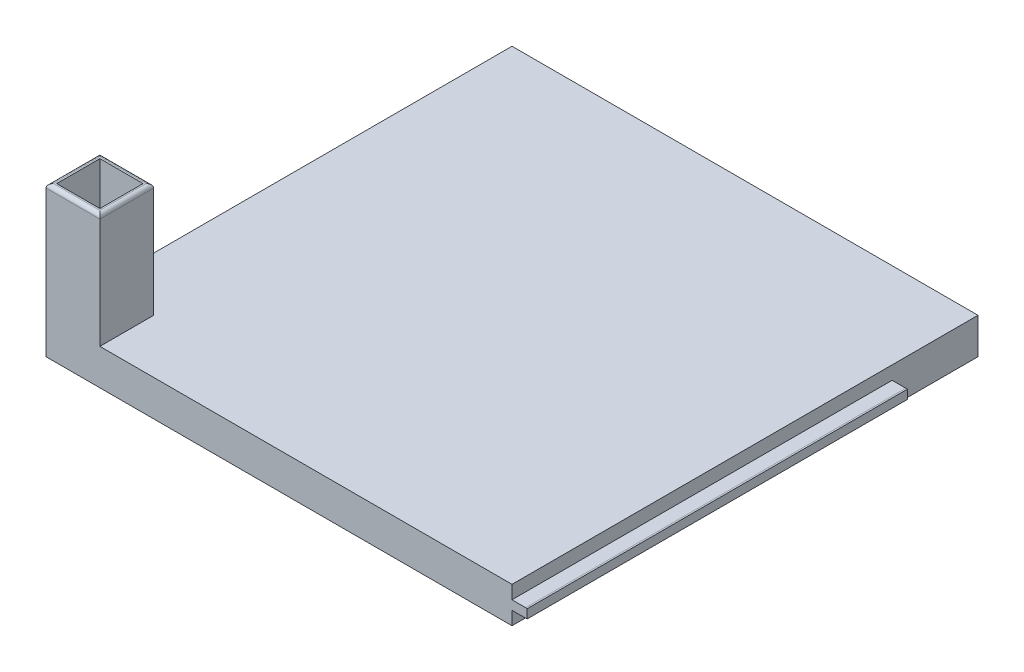
ISO-10303-21;
HEADER;
FILE_DESCRIPTION(('STEP AP214'),'2;1');
FILE_NAME('part.step','',(''),(''),'','','');
FILE_SCHEMA(('AUTOMOTIVE_DESIGN { 1 0 10303 214 1 1 1 1 }'));
ENDSEC;
DATA;
#1=APPLICATION_CONTEXT('core data for automotive mechanical design processes');
#2=APPLICATION_PROTOCOL_DEFINITION('international standard','automotive_design',2000,#1);
#3=PRODUCT_CONTEXT('',#1,'mechanical');
#4=PRODUCT('Part','Part','',(#3));
#5=PRODUCT_RELATED_PRODUCT_CATEGORY('part','',(#4));
#6=PRODUCT_DEFINITION_FORMATION('','',#4);
#7=PRODUCT_DEFINITION_CONTEXT('part definition',#1,'design');
#8=PRODUCT_DEFINITION('design','',#6,#7);
#9=PRODUCT_DEFINITION_SHAPE('','',#8);
#10=(LENGTH_UNIT() NAMED_UNIT(*) SI_UNIT(.MILLI.,.METRE.));
#11=(NAMED_UNIT(*) PLANE_ANGLE_UNIT() SI_UNIT($,.RADIAN.));
#12=(NAMED_UNIT(*) SI_UNIT($,.STERADIAN.) SOLID_ANGLE_UNIT());
#13=UNCERTAINTY_MEASURE_WITH_UNIT(LENGTH_MEASURE(1.E-05),#10,'distance_accuracy_value','');
#14=(GEOMETRIC_REPRESENTATION_CONTEXT(3) GLOBAL_UNCERTAINTY_ASSIGNED_CONTEXT((#13)) GLOBAL_UNIT_ASSIGNED_CONTEXT((#10,
#11,#12)) REPRESENTATION_CONTEXT('',''));
#15=CARTESIAN_POINT('',(0.,0.,0.));
#16=DIRECTION('',(0.,0.,1.));
#17=DIRECTION('',(1.,0.,0.));
#18=AXIS2_PLACEMENT_3D('',#15,#16,#17);
#19=CARTESIAN_POINT('',(-5.59121212121212,48.83,0.));
#20=DIRECTION('',(0.,0.,-1.));
#21=DIRECTION('',(-1.,0.,0.));
#22=AXIS2_PLACEMENT_3D('',#19,#20,#21);
#23=CYLINDRICAL_SURFACE('',#22,1.27);
#24=CARTESIAN_POINT('',(-5.59121212121214,48.83,123.095));
#25=DIRECTION('',(-0.707106781186547,0.,-0.707106781186548));
#26=DIRECTION('',(-0.707106781186548,0.,0.707106781186547));
#27=AXIS2_PLACEMENT_3D('',#24,#25,#26);
#28=ELLIPSE('',#27,1.79605122421383,1.27);
#29=CARTESIAN_POINT('',(-5.59121212121214,50.1,123.095));
#30=VERTEX_POINT('',#29);
#31=CARTESIAN_POINT('',(-4.32121212121214,48.83,121.825));
#32=VERTEX_POINT('',#31);
#33=EDGE_CURVE('E11',#30,#32,#28,.T.);
#34=ORIENTED_EDGE('',*,*,#33,.F.);
#35=DIRECTION('',(0.,0.,-1.));
#36=VECTOR('',#35,1.);
#37=CARTESIAN_POINT('',(-5.59121212121212,50.1,0.));
#38=LINE('',#37,#36);
#39=CARTESIAN_POINT('',(-5.59121212121214,50.1,138.555));
#40=VERTEX_POINT('',#39);
#41=EDGE_CURVE('E533',#40,#30,#38,.T.);
#42=ORIENTED_EDGE('',*,*,#41,.F.);
#43=CARTESIAN_POINT('',(-5.59121212121214,48.83,138.555));
#44=DIRECTION('',(0.707106781186548,0.,-0.707106781186547));
#45=DIRECTION('',(-0.707106781186547,0.,-0.707106781186548));
#46=AXIS2_PLACEMENT_3D('',#43,#44,#45);
#47=ELLIPSE('',#46,1.79605122421383,1.27);
#48=CARTESIAN_POINT('',(-4.32121212121214,48.83,139.825));
#49=VERTEX_POINT('',#48);
#50=EDGE_CURVE('E55',#40,#49,#47,.T.);
#51=ORIENTED_EDGE('',*,*,#50,.T.);
#52=DIRECTION('',(0.,0.,-1.));
#53=VECTOR('',#52,1.);
#54=CARTESIAN_POINT('',(-4.32121212121214,48.83,139.825));
#55=LINE('',#54,#53);
#56=EDGE_CURVE('E560',#32,#49,#55,.F.);
#57=ORIENTED_EDGE('',*,*,#56,.F.);
#58=EDGE_LOOP('',(#34,#42,#51,#57));
#59=FACE_BOUND('',#58,.T.);
#60=ADVANCED_FACE('F47',(#59),#23,.T.);
#61=CARTESIAN_POINT('',(0.,48.83,138.555));
#62=DIRECTION('',(1.,0.,0.));
#63=DIRECTION('',(0.,0.,-1.));
#64=AXIS2_PLACEMENT_3D('',#61,#62,#63);
#65=CYLINDRICAL_SURFACE('',#64,1.27);
#66=ORIENTED_EDGE('',*,*,#50,.F.);
#67=DIRECTION('',(1.,0.,0.));
#68=VECTOR('',#67,1.);
#69=CARTESIAN_POINT('',(0.,50.1,138.555));
#70=LINE('',#69,#68);
#71=CARTESIAN_POINT('',(-21.0512121212121,50.1,138.555));
#72=VERTEX_POINT('',#71);
#73=EDGE_CURVE('E537',#72,#40,#70,.T.);
#74=ORIENTED_EDGE('',*,*,#73,.F.);
#75=CARTESIAN_POINT('',(-21.0512121212121,48.83,138.555));
#76=DIRECTION('',(0.707106781186547,0.,0.707106781186547));
#77=DIRECTION('',(0.707106781186547,0.,-0.707106781186547));
#78=AXIS2_PLACEMENT_3D('',#75,#76,#77);
#79=ELLIPSE('',#78,1.79605122421383,1.27);
#80=CARTESIAN_POINT('',(-22.3212121212121,48.83,139.825));
#81=VERTEX_POINT('',#80);
#82=EDGE_CURVE('E69',#72,#81,#79,.T.);
#83=ORIENTED_EDGE('',*,*,#82,.T.);
#84=DIRECTION('',(1.,0.,0.));
#85=VECTOR('',#84,1.);
#86=CARTESIAN_POINT('',(-22.3212121212121,48.83,139.825));
#87=LINE('',#86,#85);
#88=EDGE_CURVE('E557',#49,#81,#87,.F.);
#89=ORIENTED_EDGE('',*,*,#88,.F.);
#90=EDGE_LOOP('',(#66,#74,#83,#89));
#91=FACE_BOUND('',#90,.T.);
#92=ADVANCED_FACE('F640',(#91),#65,.T.);
#93=CARTESIAN_POINT('',(-21.0512121212121,48.83,0.));
#94=DIRECTION('',(0.,0.,1.));
#95=DIRECTION('',(1.,0.,0.));
#96=AXIS2_PLACEMENT_3D('',#93,#94,#95);
#97=CYLINDRICAL_SURFACE('',#96,1.27);
#98=ORIENTED_EDGE('',*,*,#82,.F.);
#99=DIRECTION('',(0.,0.,1.));
#100=VECTOR('',#99,1.);
#101=CARTESIAN_POINT('',(-21.0512121212121,50.1,0.));
#102=LINE('',#101,#100);
#103=CARTESIAN_POINT('',(-21.0512121212121,50.1,123.095));
#104=VERTEX_POINT('',#103);
#105=EDGE_CURVE('E541',#104,#72,#102,.T.);
#106=ORIENTED_EDGE('',*,*,#105,.F.);
#107=CARTESIAN_POINT('',(-21.0512121212121,48.83,123.095));
#108=DIRECTION('',(-0.707106781186547,0.,0.707106781186547));
#109=DIRECTION('',(0.707106781186547,0.,0.707106781186547));
#110=AXIS2_PLACEMENT_3D('',#107,#108,#109);
#111=ELLIPSE('',#110,1.79605122421383,1.27);
#112=CARTESIAN_POINT('',(-22.3212121212121,48.83,121.825));
#113=VERTEX_POINT('',#112);
#114=EDGE_CURVE('E563',#104,#113,#111,.T.);
#115=ORIENTED_EDGE('',*,*,#114,.T.);
#116=DIRECTION('',(0.,0.,1.));
#117=VECTOR('',#116,1.);
#118=CARTESIAN_POINT('',(-22.3212121212121,48.83,-15.875));
#119=LINE('',#118,#117);
#120=EDGE_CURVE('E553',#81,#113,#119,.F.);
#121=ORIENTED_EDGE('',*,*,#120,.F.);
#122=EDGE_LOOP('',(#98,#106,#115,#121));
#123=FACE_BOUND('',#122,.T.);
#124=ADVANCED_FACE('F645',(#123),#97,.T.);
#125=CARTESIAN_POINT('',(0.,48.83,123.095));
#126=DIRECTION('',(-1.,0.,0.));
#127=DIRECTION('',(0.,0.,1.));
#128=AXIS2_PLACEMENT_3D('',#125,#126,#127);
#129=CYLINDRICAL_SURFACE('',#128,1.27);
#130=DIRECTION('',(-1.,0.,0.));
#131=VECTOR('',#130,1.);
#132=CARTESIAN_POINT('',(0.,50.1,123.095));
#133=LINE('',#132,#131);
#134=EDGE_CURVE('E545',#30,#104,#133,.T.);
#135=ORIENTED_EDGE('',*,*,#134,.F.);
#136=ORIENTED_EDGE('',*,*,#33,.T.);
#137=DIRECTION('',(-1.,0.,0.));
#138=VECTOR('',#137,1.);
#139=CARTESIAN_POINT('',(-22.3212121212121,48.83,121.825));
#140=LINE('',#139,#138);
#141=EDGE_CURVE('E549',#113,#32,#140,.F.);
#142=ORIENTED_EDGE('',*,*,#141,.F.);
#143=ORIENTED_EDGE('',*,*,#114,.F.);
#144=EDGE_LOOP('',(#135,#136,#142,#143));
#145=FACE_BOUND('',#144,.T.);
#146=ADVANCED_FACE('F597',(#145),#129,.T.);
#147=CARTESIAN_POINT('',(0.,50.1,0.));
#148=DIRECTION('',(0.,-1.,0.));
#149=DIRECTION('',(0.,0.,-1.));
#150=AXIS2_PLACEMENT_3D('',#147,#148,#149);
#151=PLANE('',#150);
#152=ORIENTED_EDGE('',*,*,#41,.T.);
#153=ORIENTED_EDGE('',*,*,#134,.T.);
#154=ORIENTED_EDGE('',*,*,#105,.T.);
#155=ORIENTED_EDGE('',*,*,#73,.T.);
#156=EDGE_LOOP('',(#152,#153,#154,#155));
#157=FACE_BOUND('',#156,.T.);
#158=DIRECTION('',(0.,0.,1.));
#159=VECTOR('',#158,1.);
#160=CARTESIAN_POINT('',(-20.5432121212121,50.1,0.));
#161=LINE('',#160,#159);
#162=CARTESIAN_POINT('',(-20.5432121212121,50.1,123.603));
#163=VERTEX_POINT('',#162);
#164=CARTESIAN_POINT('',(-20.5432121212121,50.1,138.047));
#165=VERTEX_POINT('',#164);
#166=EDGE_CURVE('E343',#163,#165,#161,.T.);
#167=ORIENTED_EDGE('',*,*,#166,.F.);
#168=DIRECTION('',(-1.,0.,0.));
#169=VECTOR('',#168,1.);
#170=CARTESIAN_POINT('',(0.,50.1,123.603));
#171=LINE('',#170,#169);
#172=CARTESIAN_POINT('',(-6.09921212121214,50.1,123.603));
#173=VERTEX_POINT('',#172);
#174=EDGE_CURVE('E312',#173,#163,#171,.T.);
#175=ORIENTED_EDGE('',*,*,#174,.F.);
#176=DIRECTION('',(0.,0.,-1.));
#177=VECTOR('',#176,1.);
#178=CARTESIAN_POINT('',(-6.09921212121212,50.1,0.));
#179=LINE('',#178,#177);
#180=CARTESIAN_POINT('',(-6.09921212121214,50.1,138.047));
#181=VERTEX_POINT('',#180);
#182=EDGE_CURVE('E365',#181,#173,#179,.T.);
#183=ORIENTED_EDGE('',*,*,#182,.F.);
#184=DIRECTION('',(1.,0.,0.));
#185=VECTOR('',#184,1.);
#186=CARTESIAN_POINT('',(0.,50.1,138.047));
#187=LINE('',#186,#185);
#188=EDGE_CURVE('E362',#165,#181,#187,.T.);
#189=ORIENTED_EDGE('',*,*,#188,.F.);
#190=EDGE_LOOP('',(#167,#175,#183,#189));
#191=FACE_BOUND('',#190,.T.);
#192=ADVANCED_FACE('F648',(#157,#191),#151,.F.);
#193=CARTESIAN_POINT('',(133.378787878788,12.,-15.875));
#194=DIRECTION('',(-1.,0.,0.));
#195=DIRECTION('',(0.,0.,1.));
#196=AXIS2_PLACEMENT_3D('',#193,#194,#195);
#197=PLANE('',#196);
#198=DIRECTION('',(0.,0.,1.));
#199=VECTOR('',#198,1.);
#200=CARTESIAN_POINT('',(133.378787878788,7.524,12.825));
#201=LINE('',#200,#199);
#202=CARTESIAN_POINT('',(133.378787878788,7.524,12.825));
#203=VERTEX_POINT('',#202);
#204=CARTESIAN_POINT('',(133.378787878788,7.524,139.825));
#205=VERTEX_POINT('',#204);
#206=EDGE_CURVE('E437',#203,#205,#201,.T.);
#207=ORIENTED_EDGE('',*,*,#206,.F.);
#208=DIRECTION('',(0.,-1.,0.));
#209=VECTOR('',#208,1.);
#210=CARTESIAN_POINT('',(133.378787878788,7.524,12.825));
#211=LINE('',#210,#209);
#212=CARTESIAN_POINT('',(133.378787878788,4.476,12.825));
#213=VERTEX_POINT('',#212);
#214=EDGE_CURVE('E413',#203,#213,#211,.T.);
#215=ORIENTED_EDGE('',*,*,#214,.T.);
#216=DIRECTION('',(0.,0.,1.));
#217=VECTOR('',#216,1.);
#218=CARTESIAN_POINT('',(133.378787878788,4.476,12.825));
#219=LINE('',#218,#217);
#220=CARTESIAN_POINT('',(133.378787878788,4.476,139.825));
#221=VERTEX_POINT('',#220);
#222=EDGE_CURVE('E428',#213,#221,#219,.T.);
#223=ORIENTED_EDGE('',*,*,#222,.T.);
#224=DIRECTION('',(0.,-1.,0.));
#225=VECTOR('',#224,1.);
#226=CARTESIAN_POINT('',(133.378787878788,12.,139.825));
#227=LINE('',#226,#225);
#228=CARTESIAN_POINT('',(133.378787878788,0.,139.825));
#229=VERTEX_POINT('',#228);
#230=EDGE_CURVE('E498',#221,#229,#227,.T.);
#231=ORIENTED_EDGE('',*,*,#230,.T.);
#232=DIRECTION('',(0.,0.,-1.));
#233=VECTOR('',#232,1.);
#234=CARTESIAN_POINT('',(133.378787878788,0.,-15.875));
#235=LINE('',#234,#233);
#236=CARTESIAN_POINT('',(133.378787878788,0.,-15.875));
#237=VERTEX_POINT('',#236);
#238=EDGE_CURVE('E484',#229,#237,#235,.T.);
#239=ORIENTED_EDGE('',*,*,#238,.T.);
#240=DIRECTION('',(0.,-1.,0.));
#241=VECTOR('',#240,1.);
#242=CARTESIAN_POINT('',(133.378787878788,12.,-15.875));
#243=LINE('',#242,#241);
#244=CARTESIAN_POINT('',(133.378787878788,12.,-15.875));
#245=VERTEX_POINT('',#244);
#246=EDGE_CURVE('E494',#245,#237,#243,.T.);
#247=ORIENTED_EDGE('',*,*,#246,.F.);
#248=DIRECTION('',(0.,0.,-1.));
#249=VECTOR('',#248,1.);
#250=CARTESIAN_POINT('',(133.378787878788,12.,-15.875));
#251=LINE('',#250,#249);
#252=CARTESIAN_POINT('',(133.378787878788,12.,139.825));
#253=VERTEX_POINT('',#252);
#254=EDGE_CURVE('E470',#253,#245,#251,.T.);
#255=ORIENTED_EDGE('',*,*,#254,.F.);
#256=EDGE_CURVE('E499',#253,#205,#227,.T.);
#257=ORIENTED_EDGE('',*,*,#256,.T.);
#258=EDGE_LOOP('',(#207,#215,#223,#231,#239,#247,#255,#257));
#259=FACE_BOUND('',#258,.T.);
#260=ADVANCED_FACE('F613',(#259),#197,.F.);
#261=CARTESIAN_POINT('',(-22.3212121212121,12.,-15.875));
#262=DIRECTION('',(1.,0.,0.));
#263=DIRECTION('',(0.,0.,-1.));
#264=AXIS2_PLACEMENT_3D('',#261,#262,#263);
#265=PLANE('',#264);
#266=DIRECTION('',(0.,-1.,0.));
#267=VECTOR('',#266,1.);
#268=CARTESIAN_POINT('',(-22.3212121212121,12.,139.825));
#269=LINE('',#268,#267);
#270=CARTESIAN_POINT('',(-22.3212121212121,0.,139.825));
#271=VERTEX_POINT('',#270);
#272=EDGE_CURVE('E503',#81,#271,#269,.T.);
#273=ORIENTED_EDGE('',*,*,#272,.F.);
#274=ORIENTED_EDGE('',*,*,#120,.T.);
#275=DIRECTION('',(0.,-1.,0.));
#276=VECTOR('',#275,1.);
#277=CARTESIAN_POINT('',(-22.3212121212121,50.1,121.825));
#278=LINE('',#277,#276);
#279=CARTESIAN_POINT('',(-22.3212121212121,12.,121.825));
#280=VERTEX_POINT('',#279);
#281=EDGE_CURVE('E452',#113,#280,#278,.T.);
#282=ORIENTED_EDGE('',*,*,#281,.T.);
#283=DIRECTION('',(0.,0.,1.));
#284=VECTOR('',#283,1.);
#285=CARTESIAN_POINT('',(-22.3212121212121,12.,-15.875));
#286=LINE('',#285,#284);
#287=CARTESIAN_POINT('',(-22.3212121212121,12.,-15.875));
#288=VERTEX_POINT('',#287);
#289=EDGE_CURVE('E462',#288,#280,#286,.T.);
#290=ORIENTED_EDGE('',*,*,#289,.F.);
#291=DIRECTION('',(0.,-1.,0.));
#292=VECTOR('',#291,1.);
#293=CARTESIAN_POINT('',(-22.3212121212121,12.,-15.875));
#294=LINE('',#293,#292);
#295=CARTESIAN_POINT('',(-22.3212121212121,7.5875,-15.875));
#296=VERTEX_POINT('',#295);
#297=EDGE_CURVE('E490',#288,#296,#294,.T.);
#298=ORIENTED_EDGE('',*,*,#297,.T.);
#299=DIRECTION('',(0.,0.,1.));
#300=VECTOR('',#299,1.);
#301=CARTESIAN_POINT('',(-22.3212121212121,7.5875,-15.875));
#302=LINE('',#301,#300);
#303=CARTESIAN_POINT('',(-22.3212121212121,7.5875,-10.541));
#304=VERTEX_POINT('',#303);
#305=EDGE_CURVE('E379',#296,#304,#302,.T.);
#306=ORIENTED_EDGE('',*,*,#305,.T.);
#307=DIRECTION('',(0.,-1.,0.));
#308=VECTOR('',#307,1.);
#309=CARTESIAN_POINT('',(-22.3212121212121,7.5875,-10.541));
#310=LINE('',#309,#308);
#311=CARTESIAN_POINT('',(-22.3212121212121,4.4125,-10.541));
#312=VERTEX_POINT('',#311);
#313=EDGE_CURVE('E393',#304,#312,#310,.T.);
#314=ORIENTED_EDGE('',*,*,#313,.T.);
#315=DIRECTION('',(0.,0.,1.));
#316=VECTOR('',#315,1.);
#317=CARTESIAN_POINT('',(-22.3212121212121,4.4125,-15.875));
#318=LINE('',#317,#316);
#319=CARTESIAN_POINT('',(-22.3212121212121,4.4125,-15.875));
#320=VERTEX_POINT('',#319);
#321=EDGE_CURVE('E292',#320,#312,#318,.T.);
#322=ORIENTED_EDGE('',*,*,#321,.F.);
#323=CARTESIAN_POINT('',(-22.3212121212121,0.,-15.875));
#324=VERTEX_POINT('',#323);
#325=EDGE_CURVE('E476',#320,#324,#294,.T.);
#326=ORIENTED_EDGE('',*,*,#325,.T.);
#327=DIRECTION('',(0.,0.,1.));
#328=VECTOR('',#327,1.);
#329=CARTESIAN_POINT('',(-22.3212121212121,0.,-15.875));
#330=LINE('',#329,#328);
#331=EDGE_CURVE('E461',#324,#271,#330,.T.);
#332=ORIENTED_EDGE('',*,*,#331,.T.);
#333=EDGE_LOOP('',(#273,#274,#282,#290,#298,#306,#314,#322,#326,#332));
#334=FACE_BOUND('',#333,.T.);
#335=ADVANCED_FACE('F574',(#334),#265,.F.);
#336=CARTESIAN_POINT('',(-22.3212121212121,12.,139.825));
#337=DIRECTION('',(0.,0.,-1.));
#338=DIRECTION('',(-1.,0.,0.));
#339=AXIS2_PLACEMENT_3D('',#336,#337,#338);
#340=PLANE('',#339);
#341=DIRECTION('',(0.,-1.,0.));
#342=VECTOR('',#341,1.);
#343=CARTESIAN_POINT('',(-4.32121212121214,50.1,139.825));
#344=LINE('',#343,#342);
#345=CARTESIAN_POINT('',(-4.32121212121214,12.,139.825));
#346=VERTEX_POINT('',#345);
#347=EDGE_CURVE('E458',#49,#346,#344,.T.);
#348=ORIENTED_EDGE('',*,*,#347,.F.);
#349=ORIENTED_EDGE('',*,*,#88,.T.);
#350=ORIENTED_EDGE('',*,*,#272,.T.);
#351=DIRECTION('',(1.,0.,0.));
#352=VECTOR('',#351,1.);
#353=CARTESIAN_POINT('',(-22.3212121212121,0.,139.825));
#354=LINE('',#353,#352);
#355=EDGE_CURVE('E480',#271,#229,#354,.T.);
#356=ORIENTED_EDGE('',*,*,#355,.T.);
#357=ORIENTED_EDGE('',*,*,#230,.F.);
#358=DIRECTION('',(1.,0.,0.));
#359=VECTOR('',#358,1.);
#360=CARTESIAN_POINT('',(133.378787878788,4.476,139.825));
#361=LINE('',#360,#359);
#362=CARTESIAN_POINT('',(137.950787878788,4.476,139.825));
#363=VERTEX_POINT('',#362);
#364=EDGE_CURVE('E403',#221,#363,#361,.T.);
#365=ORIENTED_EDGE('',*,*,#364,.T.);
#366=DIRECTION('',(-0.997564050259824,-0.0697564737441272,0.));
#367=VECTOR('',#366,1.);
#368=CARTESIAN_POINT('',(137.950787878788,4.476,139.825));
#369=LINE('',#368,#367);
#370=CARTESIAN_POINT('',(138.458787878788,4.51152282046731,139.825));
#371=VERTEX_POINT('',#370);
#372=EDGE_CURVE('E524',#363,#371,#369,.F.);
#373=ORIENTED_EDGE('',*,*,#372,.T.);
#374=DIRECTION('',(0.,1.,0.));
#375=VECTOR('',#374,1.);
#376=CARTESIAN_POINT('',(138.458787878788,7.524,139.825));
#377=LINE('',#376,#375);
#378=CARTESIAN_POINT('',(138.458787878788,7.4884771795327,139.825));
#379=VERTEX_POINT('',#378);
#380=EDGE_CURVE('E432',#371,#379,#377,.T.);
#381=ORIENTED_EDGE('',*,*,#380,.T.);
#382=DIRECTION('',(0.997564050259824,-0.0697564737441272,0.));
#383=VECTOR('',#382,1.);
#384=CARTESIAN_POINT('',(138.458787878788,7.4884771795327,139.825));
#385=LINE('',#384,#383);
#386=CARTESIAN_POINT('',(137.950787878788,7.524,139.825));
#387=VERTEX_POINT('',#386);
#388=EDGE_CURVE('E510',#379,#387,#385,.F.);
#389=ORIENTED_EDGE('',*,*,#388,.T.);
#390=DIRECTION('',(-1.,0.,0.));
#391=VECTOR('',#390,1.);
#392=CARTESIAN_POINT('',(133.378787878788,7.524,139.825));
#393=LINE('',#392,#391);
#394=EDGE_CURVE('E418',#387,#205,#393,.T.);
#395=ORIENTED_EDGE('',*,*,#394,.T.);
#396=ORIENTED_EDGE('',*,*,#256,.F.);
#397=DIRECTION('',(1.,0.,0.));
#398=VECTOR('',#397,1.);
#399=CARTESIAN_POINT('',(-22.3212121212121,12.,139.825));
#400=LINE('',#399,#398);
#401=EDGE_CURVE('E466',#346,#253,#400,.T.);
#402=ORIENTED_EDGE('',*,*,#401,.F.);
#403=EDGE_LOOP('',(#348,#349,#350,#356,#357,#365,#373,#381,#389,#395,#396,#402));
#404=FACE_BOUND('',#403,.T.);
#405=ADVANCED_FACE('F589',(#404),#340,.F.);
#406=CARTESIAN_POINT('',(-22.3212121212121,12.,-15.875));
#407=DIRECTION('',(0.,0.,1.));
#408=DIRECTION('',(1.,0.,0.));
#409=AXIS2_PLACEMENT_3D('',#406,#407,#408);
#410=PLANE('',#409);
#411=ORIENTED_EDGE('',*,*,#325,.F.);
#412=DIRECTION('',(-1.,0.,0.));
#413=VECTOR('',#412,1.);
#414=CARTESIAN_POINT('',(127.538787878788,4.4125,-15.875));
#415=LINE('',#414,#413);
#416=CARTESIAN_POINT('',(127.538787878788,4.4125,-15.875));
#417=VERTEX_POINT('',#416);
#418=EDGE_CURVE('E400',#417,#320,#415,.T.);
#419=ORIENTED_EDGE('',*,*,#418,.F.);
#420=DIRECTION('',(0.,-1.,0.));
#421=VECTOR('',#420,1.);
#422=CARTESIAN_POINT('',(127.538787878788,7.5875,-15.875));
#423=LINE('',#422,#421);
#424=CARTESIAN_POINT('',(127.538787878788,7.5875,-15.875));
#425=VERTEX_POINT('',#424);
#426=EDGE_CURVE('E385',#425,#417,#423,.T.);
#427=ORIENTED_EDGE('',*,*,#426,.F.);
#428=DIRECTION('',(-1.,0.,0.));
#429=VECTOR('',#428,1.);
#430=CARTESIAN_POINT('',(127.538787878788,7.5875,-15.875));
#431=LINE('',#430,#429);
#432=EDGE_CURVE('E404',#425,#296,#431,.T.);
#433=ORIENTED_EDGE('',*,*,#432,.T.);
#434=ORIENTED_EDGE('',*,*,#297,.F.);
#435=DIRECTION('',(-1.,0.,0.));
#436=VECTOR('',#435,1.);
#437=CARTESIAN_POINT('',(-22.3212121212121,12.,-15.875));
#438=LINE('',#437,#436);
#439=EDGE_CURVE('E473',#245,#288,#438,.T.);
#440=ORIENTED_EDGE('',*,*,#439,.F.);
#441=ORIENTED_EDGE('',*,*,#246,.T.);
#442=DIRECTION('',(-1.,0.,0.));
#443=VECTOR('',#442,1.);
#444=CARTESIAN_POINT('',(-22.3212121212121,0.,-15.875));
#445=LINE('',#444,#443);
#446=EDGE_CURVE('E467',#237,#324,#445,.T.);
#447=ORIENTED_EDGE('',*,*,#446,.T.);
#448=EDGE_LOOP('',(#411,#419,#427,#433,#434,#440,#441,#447));
#449=FACE_BOUND('',#448,.T.);
#450=ADVANCED_FACE('F579',(#449),#410,.F.);
#451=CARTESIAN_POINT('',(0.,12.,0.));
#452=DIRECTION('',(0.,1.,0.));
#453=DIRECTION('',(0.,0.,1.));
#454=AXIS2_PLACEMENT_3D('',#451,#452,#453);
#455=PLANE('',#454);
#456=DIRECTION('',(-1.,0.,0.));
#457=VECTOR('',#456,1.);
#458=CARTESIAN_POINT('',(-22.3212121212121,12.,121.825));
#459=LINE('',#458,#457);
#460=CARTESIAN_POINT('',(-4.32121212121214,12.,121.825));
#461=VERTEX_POINT('',#460);
#462=EDGE_CURVE('E448',#461,#280,#459,.T.);
#463=ORIENTED_EDGE('',*,*,#462,.F.);
#464=DIRECTION('',(0.,0.,-1.));
#465=VECTOR('',#464,1.);
#466=CARTESIAN_POINT('',(-4.32121212121214,12.,139.825));
#467=LINE('',#466,#465);
#468=EDGE_CURVE('E441',#346,#461,#467,.T.);
#469=ORIENTED_EDGE('',*,*,#468,.F.);
#470=ORIENTED_EDGE('',*,*,#401,.T.);
#471=ORIENTED_EDGE('',*,*,#254,.T.);
#472=ORIENTED_EDGE('',*,*,#439,.T.);
#473=ORIENTED_EDGE('',*,*,#289,.T.);
#474=EDGE_LOOP('',(#463,#469,#470,#471,#472,#473));
#475=FACE_BOUND('',#474,.T.);
#476=ADVANCED_FACE('F604',(#475),#455,.T.);
#477=CARTESIAN_POINT('',(0.,0.,0.));
#478=DIRECTION('',(0.,1.,0.));
#479=DIRECTION('',(0.,0.,1.));
#480=AXIS2_PLACEMENT_3D('',#477,#478,#479);
#481=PLANE('',#480);
#482=ORIENTED_EDGE('',*,*,#331,.F.);
#483=ORIENTED_EDGE('',*,*,#446,.F.);
#484=ORIENTED_EDGE('',*,*,#238,.F.);
#485=ORIENTED_EDGE('',*,*,#355,.F.);
#486=EDGE_LOOP('',(#482,#483,#484,#485));
#487=FACE_BOUND('',#486,.T.);
#488=ADVANCED_FACE('F585',(#487),#481,.F.);
#489=CARTESIAN_POINT('',(-4.32121212121214,50.1,139.825));
#490=DIRECTION('',(-1.,0.,0.));
#491=DIRECTION('',(0.,0.,1.));
#492=AXIS2_PLACEMENT_3D('',#489,#490,#491);
#493=PLANE('',#492);
#494=DIRECTION('',(0.,-1.,0.));
#495=VECTOR('',#494,1.);
#496=CARTESIAN_POINT('',(-4.32121212121214,50.1,121.825));
#497=LINE('',#496,#495);
#498=EDGE_CURVE('E455',#32,#461,#497,.T.);
#499=ORIENTED_EDGE('',*,*,#498,.F.);
#500=ORIENTED_EDGE('',*,*,#56,.T.);
#501=ORIENTED_EDGE('',*,*,#347,.T.);
#502=ORIENTED_EDGE('',*,*,#468,.T.);
#503=EDGE_LOOP('',(#499,#500,#501,#502));
#504=FACE_BOUND('',#503,.T.);
#505=ADVANCED_FACE('F607',(#504),#493,.F.);
#506=CARTESIAN_POINT('',(-22.3212121212121,50.1,121.825));
#507=DIRECTION('',(0.,0.,1.));
#508=DIRECTION('',(1.,0.,0.));
#509=AXIS2_PLACEMENT_3D('',#506,#507,#508);
#510=PLANE('',#509);
#511=ORIENTED_EDGE('',*,*,#281,.F.);
#512=ORIENTED_EDGE('',*,*,#141,.T.);
#513=ORIENTED_EDGE('',*,*,#498,.T.);
#514=ORIENTED_EDGE('',*,*,#462,.T.);
#515=EDGE_LOOP('',(#511,#512,#513,#514));
#516=FACE_BOUND('',#515,.T.);
#517=ADVANCED_FACE('F600',(#516),#510,.F.);
#518=CARTESIAN_POINT('',(133.378787878788,7.524,12.825));
#519=DIRECTION('',(0.,1.,0.));
#520=DIRECTION('',(0.,0.,1.));
#521=AXIS2_PLACEMENT_3D('',#518,#519,#520);
#522=PLANE('',#521);
#523=ORIENTED_EDGE('',*,*,#394,.F.);
#524=DIRECTION('',(0.,0.,-1.));
#525=VECTOR('',#524,1.);
#526=CARTESIAN_POINT('',(137.950787878788,7.524,12.825));
#527=LINE('',#526,#525);
#528=CARTESIAN_POINT('',(137.950787878788,7.524,12.825));
#529=VERTEX_POINT('',#528);
#530=EDGE_CURVE('E513',#387,#529,#527,.T.);
#531=ORIENTED_EDGE('',*,*,#530,.T.);
#532=DIRECTION('',(-1.,0.,0.));
#533=VECTOR('',#532,1.);
#534=CARTESIAN_POINT('',(133.378787878788,7.524,12.825));
#535=LINE('',#534,#533);
#536=EDGE_CURVE('E425',#529,#203,#535,.T.);
#537=ORIENTED_EDGE('',*,*,#536,.T.);
#538=ORIENTED_EDGE('',*,*,#206,.T.);
#539=EDGE_LOOP('',(#523,#531,#537,#538));
#540=FACE_BOUND('',#539,.T.);
#541=ADVANCED_FACE('F688',(#540),#522,.T.);
#542=CARTESIAN_POINT('',(138.458787878788,7.524,12.825));
#543=DIRECTION('',(1.,0.,0.));
#544=DIRECTION('',(0.,0.,-1.));
#545=AXIS2_PLACEMENT_3D('',#542,#543,#544);
#546=PLANE('',#545);
#547=ORIENTED_EDGE('',*,*,#380,.F.);
#548=DIRECTION('',(0.,0.,-1.));
#549=VECTOR('',#548,1.);
#550=CARTESIAN_POINT('',(138.458787878788,4.51152282046731,12.825));
#551=LINE('',#550,#549);
#552=CARTESIAN_POINT('',(138.458787878788,4.51152282046731,12.825));
#553=VERTEX_POINT('',#552);
#554=EDGE_CURVE('E527',#371,#553,#551,.T.);
#555=ORIENTED_EDGE('',*,*,#554,.T.);
#556=DIRECTION('',(0.,1.,0.));
#557=VECTOR('',#556,1.);
#558=CARTESIAN_POINT('',(138.458787878788,7.524,12.825));
#559=LINE('',#558,#557);
#560=CARTESIAN_POINT('',(138.458787878788,7.4884771795327,12.825));
#561=VERTEX_POINT('',#560);
#562=EDGE_CURVE('E422',#553,#561,#559,.T.);
#563=ORIENTED_EDGE('',*,*,#562,.T.);
#564=DIRECTION('',(0.,0.,1.));
#565=VECTOR('',#564,1.);
#566=CARTESIAN_POINT('',(138.458787878788,7.4884771795327,12.825));
#567=LINE('',#566,#565);
#568=EDGE_CURVE('E506',#561,#379,#567,.T.);
#569=ORIENTED_EDGE('',*,*,#568,.T.);
#570=EDGE_LOOP('',(#547,#555,#563,#569));
#571=FACE_BOUND('',#570,.T.);
#572=ADVANCED_FACE('F694',(#571),#546,.T.);
#573=CARTESIAN_POINT('',(133.378787878788,4.476,12.825));
#574=DIRECTION('',(0.,-1.,0.));
#575=DIRECTION('',(0.,0.,-1.));
#576=AXIS2_PLACEMENT_3D('',#573,#574,#575);
#577=PLANE('',#576);
#578=DIRECTION('',(1.,0.,0.));
#579=VECTOR('',#578,1.);
#580=CARTESIAN_POINT('',(133.378787878788,4.476,12.825));
#581=LINE('',#580,#579);
#582=CARTESIAN_POINT('',(137.950787878788,4.476,12.825));
#583=VERTEX_POINT('',#582);
#584=EDGE_CURVE('E417',#213,#583,#581,.T.);
#585=ORIENTED_EDGE('',*,*,#584,.T.);
#586=DIRECTION('',(0.,0.,1.));
#587=VECTOR('',#586,1.);
#588=CARTESIAN_POINT('',(137.950787878788,4.476,12.825));
#589=LINE('',#588,#587);
#590=EDGE_CURVE('E520',#583,#363,#589,.T.);
#591=ORIENTED_EDGE('',*,*,#590,.T.);
#592=ORIENTED_EDGE('',*,*,#364,.F.);
#593=ORIENTED_EDGE('',*,*,#222,.F.);
#594=EDGE_LOOP('',(#585,#591,#592,#593));
#595=FACE_BOUND('',#594,.T.);
#596=ADVANCED_FACE('F691',(#595),#577,.T.);
#597=CARTESIAN_POINT('',(0.,0.,12.825));
#598=DIRECTION('',(0.,0.,1.));
#599=DIRECTION('',(1.,0.,0.));
#600=AXIS2_PLACEMENT_3D('',#597,#598,#599);
#601=PLANE('',#600);
#602=ORIENTED_EDGE('',*,*,#562,.F.);
#603=DIRECTION('',(0.997564050259824,0.0697564737441272,0.));
#604=VECTOR('',#603,1.);
#605=CARTESIAN_POINT('',(137.950787878788,4.476,12.825));
#606=LINE('',#605,#604);
#607=EDGE_CURVE('E530',#553,#583,#606,.F.);
#608=ORIENTED_EDGE('',*,*,#607,.T.);
#609=ORIENTED_EDGE('',*,*,#584,.F.);
#610=ORIENTED_EDGE('',*,*,#214,.F.);
#611=ORIENTED_EDGE('',*,*,#536,.F.);
#612=DIRECTION('',(-0.997564050259824,0.0697564737441272,0.));
#613=VECTOR('',#612,1.);
#614=CARTESIAN_POINT('',(138.458787878788,7.4884771795327,12.825));
#615=LINE('',#614,#613);
#616=EDGE_CURVE('E516',#529,#561,#615,.F.);
#617=ORIENTED_EDGE('',*,*,#616,.T.);
#618=EDGE_LOOP('',(#602,#608,#609,#610,#611,#617));
#619=FACE_BOUND('',#618,.T.);
#620=ADVANCED_FACE('F670',(#619),#601,.F.);
#621=CARTESIAN_POINT('',(138.458787878788,7.4884771795327,12.825));
#622=DIRECTION('',(-0.0697564737441272,-0.997564050259824,0.));
#623=DIRECTION('',(0.,0.,1.));
#624=AXIS2_PLACEMENT_3D('',#621,#622,#623);
#625=PLANE('',#624);
#626=ORIENTED_EDGE('',*,*,#616,.F.);
#627=ORIENTED_EDGE('',*,*,#530,.F.);
#628=ORIENTED_EDGE('',*,*,#388,.F.);
#629=ORIENTED_EDGE('',*,*,#568,.F.);
#630=EDGE_LOOP('',(#626,#627,#628,#629));
#631=FACE_BOUND('',#630,.T.);
#632=ADVANCED_FACE('F664',(#631),#625,.F.);
#633=CARTESIAN_POINT('',(137.950787878788,4.476,12.825));
#634=DIRECTION('',(-0.0697564737441272,0.997564050259824,0.));
#635=DIRECTION('',(0.,0.,1.));
#636=AXIS2_PLACEMENT_3D('',#633,#634,#635);
#637=PLANE('',#636);
#638=ORIENTED_EDGE('',*,*,#607,.F.);
#639=ORIENTED_EDGE('',*,*,#554,.F.);
#640=ORIENTED_EDGE('',*,*,#372,.F.);
#641=ORIENTED_EDGE('',*,*,#590,.F.);
#642=EDGE_LOOP('',(#638,#639,#640,#641));
#643=FACE_BOUND('',#642,.T.);
#644=ADVANCED_FACE('F658',(#643),#637,.F.);
#645=CARTESIAN_POINT('',(127.538787878788,4.4125,-15.875));
#646=DIRECTION('',(0.,-1.,0.));
#647=DIRECTION('',(0.,0.,-1.));
#648=AXIS2_PLACEMENT_3D('',#645,#646,#647);
#649=PLANE('',#648);
#650=ORIENTED_EDGE('',*,*,#321,.T.);
#651=DIRECTION('',(-1.,0.,0.));
#652=VECTOR('',#651,1.);
#653=CARTESIAN_POINT('',(127.538787878788,4.4125,-10.541));
#654=LINE('',#653,#652);
#655=CARTESIAN_POINT('',(127.538787878788,4.4125,-10.541));
#656=VERTEX_POINT('',#655);
#657=EDGE_CURVE('E389',#656,#312,#654,.T.);
#658=ORIENTED_EDGE('',*,*,#657,.F.);
#659=DIRECTION('',(0.,0.,1.));
#660=VECTOR('',#659,1.);
#661=CARTESIAN_POINT('',(127.538787878788,4.4125,-15.875));
#662=LINE('',#661,#660);
#663=EDGE_CURVE('E374',#417,#656,#662,.T.);
#664=ORIENTED_EDGE('',*,*,#663,.F.);
#665=ORIENTED_EDGE('',*,*,#418,.T.);
#666=EDGE_LOOP('',(#650,#658,#664,#665));
#667=FACE_BOUND('',#666,.T.);
#668=ADVANCED_FACE('F625',(#667),#649,.F.);
#669=CARTESIAN_POINT('',(127.538787878788,7.5875,-15.875));
#670=DIRECTION('',(0.,-1.,0.));
#671=DIRECTION('',(0.,0.,-1.));
#672=AXIS2_PLACEMENT_3D('',#669,#670,#671);
#673=PLANE('',#672);
#674=ORIENTED_EDGE('',*,*,#305,.F.);
#675=ORIENTED_EDGE('',*,*,#432,.F.);
#676=DIRECTION('',(0.,0.,1.));
#677=VECTOR('',#676,1.);
#678=CARTESIAN_POINT('',(127.538787878788,7.5875,-15.875));
#679=LINE('',#678,#677);
#680=CARTESIAN_POINT('',(127.538787878788,7.5875,-10.541));
#681=VERTEX_POINT('',#680);
#682=EDGE_CURVE('E382',#425,#681,#679,.T.);
#683=ORIENTED_EDGE('',*,*,#682,.T.);
#684=DIRECTION('',(-1.,0.,0.));
#685=VECTOR('',#684,1.);
#686=CARTESIAN_POINT('',(127.538787878788,7.5875,-10.541));
#687=LINE('',#686,#685);
#688=EDGE_CURVE('E408',#681,#304,#687,.T.);
#689=ORIENTED_EDGE('',*,*,#688,.T.);
#690=EDGE_LOOP('',(#674,#675,#683,#689));
#691=FACE_BOUND('',#690,.T.);
#692=ADVANCED_FACE('F618',(#691),#673,.T.);
#693=CARTESIAN_POINT('',(127.538787878788,7.5875,-10.541));
#694=DIRECTION('',(0.,0.,-1.));
#695=DIRECTION('',(-1.,0.,0.));
#696=AXIS2_PLACEMENT_3D('',#693,#694,#695);
#697=PLANE('',#696);
#698=ORIENTED_EDGE('',*,*,#313,.F.);
#699=ORIENTED_EDGE('',*,*,#688,.F.);
#700=DIRECTION('',(0.,-1.,0.));
#701=VECTOR('',#700,1.);
#702=CARTESIAN_POINT('',(127.538787878788,7.5875,-10.541));
#703=LINE('',#702,#701);
#704=EDGE_CURVE('E378',#681,#656,#703,.T.);
#705=ORIENTED_EDGE('',*,*,#704,.T.);
#706=ORIENTED_EDGE('',*,*,#657,.T.);
#707=EDGE_LOOP('',(#698,#699,#705,#706));
#708=FACE_BOUND('',#707,.T.);
#709=ADVANCED_FACE('F622',(#708),#697,.T.);
#710=CARTESIAN_POINT('',(127.538787878788,0.,0.));
#711=DIRECTION('',(1.,0.,0.));
#712=DIRECTION('',(0.,0.,-1.));
#713=AXIS2_PLACEMENT_3D('',#710,#711,#712);
#714=PLANE('',#713);
#715=ORIENTED_EDGE('',*,*,#663,.T.);
#716=ORIENTED_EDGE('',*,*,#704,.F.);
#717=ORIENTED_EDGE('',*,*,#682,.F.);
#718=ORIENTED_EDGE('',*,*,#426,.T.);
#719=EDGE_LOOP('',(#715,#716,#717,#718));
#720=FACE_BOUND('',#719,.T.);
#721=ADVANCED_FACE('F627',(#720),#714,.F.);
#722=CARTESIAN_POINT('',(131.600787878788,12.,-15.875));
#723=DIRECTION('',(-1.,0.,0.));
#724=DIRECTION('',(0.,0.,1.));
#725=AXIS2_PLACEMENT_3D('',#722,#723,#724);
#726=PLANE('',#725);
#727=DIRECTION('',(0.,-1.,0.));
#728=VECTOR('',#727,1.);
#729=CARTESIAN_POINT('',(131.600787878788,12.,138.047));
#730=LINE('',#729,#728);
#731=CARTESIAN_POINT('',(131.600787878788,10.222,138.047));
#732=VERTEX_POINT('',#731);
#733=CARTESIAN_POINT('',(131.600787878788,1.778,138.047));
#734=VERTEX_POINT('',#733);
#735=EDGE_CURVE('E243',#732,#734,#730,.T.);
#736=ORIENTED_EDGE('',*,*,#735,.F.);
#737=DIRECTION('',(0.,0.,-1.));
#738=VECTOR('',#737,1.);
#739=CARTESIAN_POINT('',(131.600787878788,10.222,-15.875));
#740=LINE('',#739,#738);
#741=CARTESIAN_POINT('',(131.600787878788,10.222,-14.097));
#742=VERTEX_POINT('',#741);
#743=EDGE_CURVE('E281',#732,#742,#740,.T.);
#744=ORIENTED_EDGE('',*,*,#743,.T.);
#745=DIRECTION('',(0.,-1.,0.));
#746=VECTOR('',#745,1.);
#747=CARTESIAN_POINT('',(131.600787878788,12.,-14.097));
#748=LINE('',#747,#746);
#749=CARTESIAN_POINT('',(131.600787878788,1.778,-14.097));
#750=VERTEX_POINT('',#749);
#751=EDGE_CURVE('E256',#742,#750,#748,.T.);
#752=ORIENTED_EDGE('',*,*,#751,.T.);
#753=DIRECTION('',(0.,0.,-1.));
#754=VECTOR('',#753,1.);
#755=CARTESIAN_POINT('',(131.600787878788,1.778,-15.875));
#756=LINE('',#755,#754);
#757=EDGE_CURVE('E262',#734,#750,#756,.T.);
#758=ORIENTED_EDGE('',*,*,#757,.F.);
#759=EDGE_LOOP('',(#736,#744,#752,#758));
#760=FACE_BOUND('',#759,.T.);
#761=ADVANCED_FACE('F268',(#760),#726,.T.);
#762=CARTESIAN_POINT('',(-20.5432121212121,12.,-15.875));
#763=DIRECTION('',(1.,0.,0.));
#764=DIRECTION('',(0.,0.,-1.));
#765=AXIS2_PLACEMENT_3D('',#762,#763,#764);
#766=PLANE('',#765);
#767=DIRECTION('',(0.,-1.,0.));
#768=VECTOR('',#767,1.);
#769=CARTESIAN_POINT('',(-20.5432121212121,7.5875,-8.76300000000001));
#770=LINE('',#769,#768);
#771=CARTESIAN_POINT('',(-20.5432121212121,9.3655,-8.76300000000001));
#772=VERTEX_POINT('',#771);
#773=CARTESIAN_POINT('',(-20.5432121212121,2.6345,-8.76300000000001));
#774=VERTEX_POINT('',#773);
#775=EDGE_CURVE('E294',#772,#774,#770,.T.);
#776=ORIENTED_EDGE('',*,*,#775,.F.);
#777=DIRECTION('',(0.,0.,1.));
#778=VECTOR('',#777,1.);
#779=CARTESIAN_POINT('',(-20.5432121212121,9.3655,-15.875));
#780=LINE('',#779,#778);
#781=CARTESIAN_POINT('',(-20.5432121212121,9.3655,-14.097));
#782=VERTEX_POINT('',#781);
#783=EDGE_CURVE('E298',#782,#772,#780,.T.);
#784=ORIENTED_EDGE('',*,*,#783,.F.);
#785=DIRECTION('',(0.,-1.,0.));
#786=VECTOR('',#785,1.);
#787=CARTESIAN_POINT('',(-20.5432121212121,12.,-14.097));
#788=LINE('',#787,#786);
#789=CARTESIAN_POINT('',(-20.5432121212121,10.222,-14.097));
#790=VERTEX_POINT('',#789);
#791=EDGE_CURVE('E280',#790,#782,#788,.T.);
#792=ORIENTED_EDGE('',*,*,#791,.F.);
#793=DIRECTION('',(0.,0.,1.));
#794=VECTOR('',#793,1.);
#795=CARTESIAN_POINT('',(-20.5432121212121,10.222,-15.875));
#796=LINE('',#795,#794);
#797=CARTESIAN_POINT('',(-20.5432121212121,10.222,123.603));
#798=VERTEX_POINT('',#797);
#799=EDGE_CURVE('E275',#790,#798,#796,.T.);
#800=ORIENTED_EDGE('',*,*,#799,.T.);
#801=DIRECTION('',(0.,-1.,0.));
#802=VECTOR('',#801,1.);
#803=CARTESIAN_POINT('',(-20.5432121212121,12.,123.603));
#804=LINE('',#803,#802);
#805=EDGE_CURVE('E308',#163,#798,#804,.T.);
#806=ORIENTED_EDGE('',*,*,#805,.F.);
#807=ORIENTED_EDGE('',*,*,#166,.T.);
#808=DIRECTION('',(0.,-1.,0.));
#809=VECTOR('',#808,1.);
#810=CARTESIAN_POINT('',(-20.5432121212121,12.,138.047));
#811=LINE('',#810,#809);
#812=CARTESIAN_POINT('',(-20.5432121212121,1.778,138.047));
#813=VERTEX_POINT('',#812);
#814=EDGE_CURVE('E255',#165,#813,#811,.T.);
#815=ORIENTED_EDGE('',*,*,#814,.T.);
#816=DIRECTION('',(0.,0.,1.));
#817=VECTOR('',#816,1.);
#818=CARTESIAN_POINT('',(-20.5432121212121,1.778,-15.875));
#819=LINE('',#818,#817);
#820=CARTESIAN_POINT('',(-20.5432121212121,1.778,-14.097));
#821=VERTEX_POINT('',#820);
#822=EDGE_CURVE('E265',#821,#813,#819,.T.);
#823=ORIENTED_EDGE('',*,*,#822,.F.);
#824=DIRECTION('',(0.,-1.,0.));
#825=VECTOR('',#824,1.);
#826=CARTESIAN_POINT('',(-20.5432121212121,12.,-14.097));
#827=LINE('',#826,#825);
#828=CARTESIAN_POINT('',(-20.5432121212121,2.6345,-14.097));
#829=VERTEX_POINT('',#828);
#830=EDGE_CURVE('E303',#829,#821,#827,.T.);
#831=ORIENTED_EDGE('',*,*,#830,.F.);
#832=DIRECTION('',(0.,0.,1.));
#833=VECTOR('',#832,1.);
#834=CARTESIAN_POINT('',(-20.5432121212121,2.6345,-15.875));
#835=LINE('',#834,#833);
#836=EDGE_CURVE('E299',#829,#774,#835,.T.);
#837=ORIENTED_EDGE('',*,*,#836,.T.);
#838=EDGE_LOOP('',(#776,#784,#792,#800,#806,#807,#815,#823,#831,#837));
#839=FACE_BOUND('',#838,.T.);
#840=ADVANCED_FACE('F634',(#839),#766,.T.);
#841=CARTESIAN_POINT('',(-22.3212121212121,12.,138.047));
#842=DIRECTION('',(0.,0.,-1.));
#843=DIRECTION('',(-1.,0.,0.));
#844=AXIS2_PLACEMENT_3D('',#841,#842,#843);
#845=PLANE('',#844);
#846=DIRECTION('',(1.,0.,0.));
#847=VECTOR('',#846,1.);
#848=CARTESIAN_POINT('',(-22.3212121212121,1.778,138.047));
#849=LINE('',#848,#847);
#850=EDGE_CURVE('E246',#813,#734,#849,.T.);
#851=ORIENTED_EDGE('',*,*,#850,.F.);
#852=ORIENTED_EDGE('',*,*,#814,.F.);
#853=ORIENTED_EDGE('',*,*,#188,.T.);
#854=DIRECTION('',(0.,-1.,0.));
#855=VECTOR('',#854,1.);
#856=CARTESIAN_POINT('',(-6.09921212121214,50.1,138.047));
#857=LINE('',#856,#855);
#858=CARTESIAN_POINT('',(-6.09921212121214,10.222,138.047));
#859=VERTEX_POINT('',#858);
#860=EDGE_CURVE('E287',#181,#859,#857,.T.);
#861=ORIENTED_EDGE('',*,*,#860,.T.);
#862=DIRECTION('',(1.,0.,0.));
#863=VECTOR('',#862,1.);
#864=CARTESIAN_POINT('',(-22.3212121212121,10.222,138.047));
#865=LINE('',#864,#863);
#866=EDGE_CURVE('E250',#859,#732,#865,.T.);
#867=ORIENTED_EDGE('',*,*,#866,.T.);
#868=ORIENTED_EDGE('',*,*,#735,.T.);
#869=EDGE_LOOP('',(#851,#852,#853,#861,#867,#868));
#870=FACE_BOUND('',#869,.T.);
#871=ADVANCED_FACE('F245',(#870),#845,.T.);
#872=CARTESIAN_POINT('',(-22.3212121212121,12.,-14.097));
#873=DIRECTION('',(0.,0.,1.));
#874=DIRECTION('',(1.,0.,0.));
#875=AXIS2_PLACEMENT_3D('',#872,#873,#874);
#876=PLANE('',#875);
#877=ORIENTED_EDGE('',*,*,#830,.T.);
#878=DIRECTION('',(-1.,0.,0.));
#879=VECTOR('',#878,1.);
#880=CARTESIAN_POINT('',(-22.3212121212121,1.778,-14.097));
#881=LINE('',#880,#879);
#882=EDGE_CURVE('E272',#750,#821,#881,.T.);
#883=ORIENTED_EDGE('',*,*,#882,.F.);
#884=ORIENTED_EDGE('',*,*,#751,.F.);
#885=DIRECTION('',(-1.,0.,0.));
#886=VECTOR('',#885,1.);
#887=CARTESIAN_POINT('',(-22.3212121212121,10.222,-14.097));
#888=LINE('',#887,#886);
#889=EDGE_CURVE('E283',#742,#790,#888,.T.);
#890=ORIENTED_EDGE('',*,*,#889,.T.);
#891=ORIENTED_EDGE('',*,*,#791,.T.);
#892=DIRECTION('',(-1.,0.,0.));
#893=VECTOR('',#892,1.);
#894=CARTESIAN_POINT('',(127.538787878788,9.3655,-14.097));
#895=LINE('',#894,#893);
#896=CARTESIAN_POINT('',(129.316787878788,9.3655,-14.097));
#897=VERTEX_POINT('',#896);
#898=EDGE_CURVE('E326',#897,#782,#895,.T.);
#899=ORIENTED_EDGE('',*,*,#898,.F.);
#900=DIRECTION('',(0.,-1.,0.));
#901=VECTOR('',#900,1.);
#902=CARTESIAN_POINT('',(129.316787878788,0.,-14.097));
#903=LINE('',#902,#901);
#904=CARTESIAN_POINT('',(129.316787878788,2.6345,-14.097));
#905=VERTEX_POINT('',#904);
#906=EDGE_CURVE('E327',#897,#905,#903,.T.);
#907=ORIENTED_EDGE('',*,*,#906,.T.);
#908=DIRECTION('',(-1.,0.,0.));
#909=VECTOR('',#908,1.);
#910=CARTESIAN_POINT('',(127.538787878788,2.6345,-14.097));
#911=LINE('',#910,#909);
#912=EDGE_CURVE('E322',#905,#829,#911,.T.);
#913=ORIENTED_EDGE('',*,*,#912,.T.);
#914=EDGE_LOOP('',(#877,#883,#884,#890,#891,#899,#907,#913));
#915=FACE_BOUND('',#914,.T.);
#916=ADVANCED_FACE('F753',(#915),#876,.T.);
#917=CARTESIAN_POINT('',(0.,10.222,0.));
#918=DIRECTION('',(0.,1.,0.));
#919=DIRECTION('',(0.,0.,1.));
#920=AXIS2_PLACEMENT_3D('',#917,#918,#919);
#921=PLANE('',#920);
#922=DIRECTION('',(-1.,0.,0.));
#923=VECTOR('',#922,1.);
#924=CARTESIAN_POINT('',(-22.3212121212121,10.222,123.603));
#925=LINE('',#924,#923);
#926=CARTESIAN_POINT('',(-6.09921212121214,10.222,123.603));
#927=VERTEX_POINT('',#926);
#928=EDGE_CURVE('E339',#927,#798,#925,.T.);
#929=ORIENTED_EDGE('',*,*,#928,.T.);
#930=ORIENTED_EDGE('',*,*,#799,.F.);
#931=ORIENTED_EDGE('',*,*,#889,.F.);
#932=ORIENTED_EDGE('',*,*,#743,.F.);
#933=ORIENTED_EDGE('',*,*,#866,.F.);
#934=DIRECTION('',(0.,0.,-1.));
#935=VECTOR('',#934,1.);
#936=CARTESIAN_POINT('',(-6.09921212121214,10.222,139.825));
#937=LINE('',#936,#935);
#938=EDGE_CURVE('E325',#859,#927,#937,.T.);
#939=ORIENTED_EDGE('',*,*,#938,.T.);
#940=EDGE_LOOP('',(#929,#930,#931,#932,#933,#939));
#941=FACE_BOUND('',#940,.T.);
#942=ADVANCED_FACE('F768',(#941),#921,.F.);
#943=CARTESIAN_POINT('',(0.,1.778,0.));
#944=DIRECTION('',(0.,1.,0.));
#945=DIRECTION('',(0.,0.,1.));
#946=AXIS2_PLACEMENT_3D('',#943,#944,#945);
#947=PLANE('',#946);
#948=ORIENTED_EDGE('',*,*,#822,.T.);
#949=ORIENTED_EDGE('',*,*,#850,.T.);
#950=ORIENTED_EDGE('',*,*,#757,.T.);
#951=ORIENTED_EDGE('',*,*,#882,.T.);
#952=EDGE_LOOP('',(#948,#949,#950,#951));
#953=FACE_BOUND('',#952,.T.);
#954=ADVANCED_FACE('F260',(#953),#947,.T.);
#955=CARTESIAN_POINT('',(-6.09921212121214,50.1,139.825));
#956=DIRECTION('',(-1.,0.,0.));
#957=DIRECTION('',(0.,0.,1.));
#958=AXIS2_PLACEMENT_3D('',#955,#956,#957);
#959=PLANE('',#958);
#960=ORIENTED_EDGE('',*,*,#938,.F.);
#961=ORIENTED_EDGE('',*,*,#860,.F.);
#962=ORIENTED_EDGE('',*,*,#182,.T.);
#963=DIRECTION('',(0.,-1.,0.));
#964=VECTOR('',#963,1.);
#965=CARTESIAN_POINT('',(-6.09921212121214,50.1,123.603));
#966=LINE('',#965,#964);
#967=EDGE_CURVE('E290',#173,#927,#966,.T.);
#968=ORIENTED_EDGE('',*,*,#967,.T.);
#969=EDGE_LOOP('',(#960,#961,#962,#968));
#970=FACE_BOUND('',#969,.T.);
#971=ADVANCED_FACE('F787',(#970),#959,.T.);
#972=CARTESIAN_POINT('',(-22.3212121212121,50.1,123.603));
#973=DIRECTION('',(0.,0.,1.));
#974=DIRECTION('',(1.,0.,0.));
#975=AXIS2_PLACEMENT_3D('',#972,#973,#974);
#976=PLANE('',#975);
#977=ORIENTED_EDGE('',*,*,#928,.F.);
#978=ORIENTED_EDGE('',*,*,#967,.F.);
#979=ORIENTED_EDGE('',*,*,#174,.T.);
#980=ORIENTED_EDGE('',*,*,#805,.T.);
#981=EDGE_LOOP('',(#977,#978,#979,#980));
#982=FACE_BOUND('',#981,.T.);
#983=ADVANCED_FACE('F796',(#982),#976,.T.);
#984=CARTESIAN_POINT('',(127.538787878788,2.6345,-15.875));
#985=DIRECTION('',(0.,-1.,0.));
#986=DIRECTION('',(0.,0.,-1.));
#987=AXIS2_PLACEMENT_3D('',#984,#985,#986);
#988=PLANE('',#987);
#989=ORIENTED_EDGE('',*,*,#836,.F.);
#990=ORIENTED_EDGE('',*,*,#912,.F.);
#991=DIRECTION('',(0.,0.,1.));
#992=VECTOR('',#991,1.);
#993=CARTESIAN_POINT('',(129.316787878788,2.6345,-15.875));
#994=LINE('',#993,#992);
#995=CARTESIAN_POINT('',(129.316787878788,2.6345,-8.76300000000001));
#996=VERTEX_POINT('',#995);
#997=EDGE_CURVE('E321',#905,#996,#994,.T.);
#998=ORIENTED_EDGE('',*,*,#997,.T.);
#999=DIRECTION('',(-1.,0.,0.));
#1000=VECTOR('',#999,1.);
#1001=CARTESIAN_POINT('',(127.538787878788,2.6345,-8.76300000000001));
#1002=LINE('',#1001,#1000);
#1003=EDGE_CURVE('E331',#996,#774,#1002,.T.);
#1004=ORIENTED_EDGE('',*,*,#1003,.T.);
#1005=EDGE_LOOP('',(#989,#990,#998,#1004));
#1006=FACE_BOUND('',#1005,.T.);
#1007=ADVANCED_FACE('F806',(#1006),#988,.T.);
#1008=CARTESIAN_POINT('',(127.538787878788,9.3655,-15.875));
#1009=DIRECTION('',(0.,-1.,0.));
#1010=DIRECTION('',(0.,0.,-1.));
#1011=AXIS2_PLACEMENT_3D('',#1008,#1009,#1010);
#1012=PLANE('',#1011);
#1013=ORIENTED_EDGE('',*,*,#783,.T.);
#1014=DIRECTION('',(-1.,0.,0.));
#1015=VECTOR('',#1014,1.);
#1016=CARTESIAN_POINT('',(127.538787878788,9.3655,-8.76300000000001));
#1017=LINE('',#1016,#1015);
#1018=CARTESIAN_POINT('',(129.316787878788,9.3655,-8.76300000000001));
#1019=VERTEX_POINT('',#1018);
#1020=EDGE_CURVE('E336',#1019,#772,#1017,.T.);
#1021=ORIENTED_EDGE('',*,*,#1020,.F.);
#1022=DIRECTION('',(0.,0.,1.));
#1023=VECTOR('',#1022,1.);
#1024=CARTESIAN_POINT('',(129.316787878788,9.3655,-15.875));
#1025=LINE('',#1024,#1023);
#1026=EDGE_CURVE('E332',#897,#1019,#1025,.T.);
#1027=ORIENTED_EDGE('',*,*,#1026,.F.);
#1028=ORIENTED_EDGE('',*,*,#898,.T.);
#1029=EDGE_LOOP('',(#1013,#1021,#1027,#1028));
#1030=FACE_BOUND('',#1029,.T.);
#1031=ADVANCED_FACE('F816',(#1030),#1012,.F.);
#1032=CARTESIAN_POINT('',(127.538787878788,7.5875,-8.76300000000001));
#1033=DIRECTION('',(0.,0.,-1.));
#1034=DIRECTION('',(-1.,0.,0.));
#1035=AXIS2_PLACEMENT_3D('',#1032,#1033,#1034);
#1036=PLANE('',#1035);
#1037=ORIENTED_EDGE('',*,*,#775,.T.);
#1038=ORIENTED_EDGE('',*,*,#1003,.F.);
#1039=DIRECTION('',(0.,-1.,0.));
#1040=VECTOR('',#1039,1.);
#1041=CARTESIAN_POINT('',(129.316787878788,7.5875,-8.76300000000001));
#1042=LINE('',#1041,#1040);
#1043=EDGE_CURVE('E355',#1019,#996,#1042,.T.);
#1044=ORIENTED_EDGE('',*,*,#1043,.F.);
#1045=ORIENTED_EDGE('',*,*,#1020,.T.);
#1046=EDGE_LOOP('',(#1037,#1038,#1044,#1045));
#1047=FACE_BOUND('',#1046,.T.);
#1048=ADVANCED_FACE('F826',(#1047),#1036,.F.);
#1049=CARTESIAN_POINT('',(129.316787878788,0.,0.));
#1050=DIRECTION('',(1.,0.,0.));
#1051=DIRECTION('',(0.,0.,-1.));
#1052=AXIS2_PLACEMENT_3D('',#1049,#1050,#1051);
#1053=PLANE('',#1052);
#1054=ORIENTED_EDGE('',*,*,#997,.F.);
#1055=ORIENTED_EDGE('',*,*,#906,.F.);
#1056=ORIENTED_EDGE('',*,*,#1026,.T.);
#1057=ORIENTED_EDGE('',*,*,#1043,.T.);
#1058=EDGE_LOOP('',(#1054,#1055,#1056,#1057));
#1059=FACE_BOUND('',#1058,.T.);
#1060=ADVANCED_FACE('F836',(#1059),#1053,.T.);
#1061=CLOSED_SHELL('',(#60,#92,#124,#146,#192,#260,#335,#405,#450,#476,#488,#505,#517,#541,#572,
#596,#620,#632,#644,#668,#692,#709,#721,#761,#840,#871,#916,#942,#954,#971,#983,#1007,#1031,
#1048,#1060));
#1062=MANIFOLD_SOLID_BREP('B2',#1061);
#1063=ADVANCED_BREP_SHAPE_REPRESENTATION('',(#18,#1062),#14);
#1064=SHAPE_DEFINITION_REPRESENTATION(#9,#1063);
ENDSEC;
END-ISO-10303-21;
